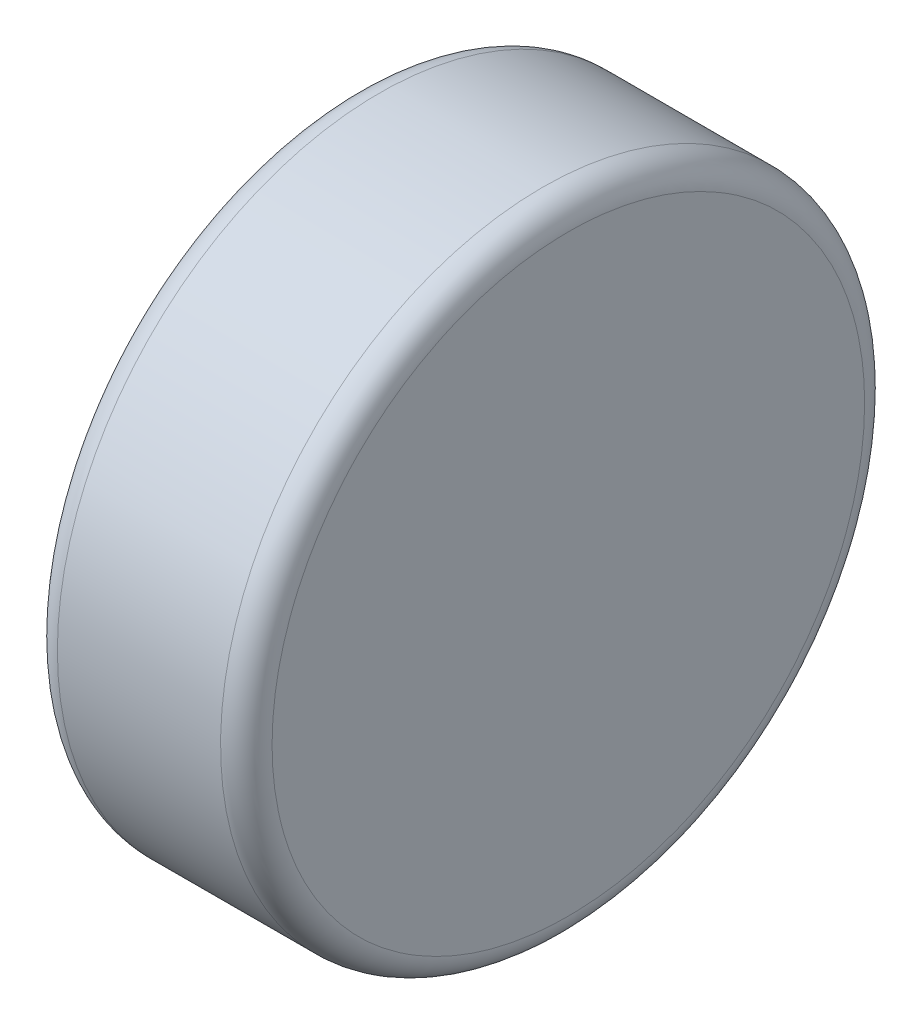
ISO-10303-21;
HEADER;
FILE_DESCRIPTION(('STEP AP214'),'2;1');
FILE_NAME('part.step','',(''),(''),'','','');
FILE_SCHEMA(('AUTOMOTIVE_DESIGN { 1 0 10303 214 1 1 1 1 }'));
ENDSEC;
DATA;
#1=APPLICATION_CONTEXT('core data for automotive mechanical design processes');
#2=APPLICATION_PROTOCOL_DEFINITION('international standard','automotive_design',2000,#1);
#3=PRODUCT_CONTEXT('',#1,'mechanical');
#4=PRODUCT('Part','Part','',(#3));
#5=PRODUCT_RELATED_PRODUCT_CATEGORY('part','',(#4));
#6=PRODUCT_DEFINITION_FORMATION('','',#4);
#7=PRODUCT_DEFINITION_CONTEXT('part definition',#1,'design');
#8=PRODUCT_DEFINITION('design','',#6,#7);
#9=PRODUCT_DEFINITION_SHAPE('','',#8);
#10=(LENGTH_UNIT() NAMED_UNIT(*) SI_UNIT(.MILLI.,.METRE.));
#11=(NAMED_UNIT(*) PLANE_ANGLE_UNIT() SI_UNIT($,.RADIAN.));
#12=(NAMED_UNIT(*) SI_UNIT($,.STERADIAN.) SOLID_ANGLE_UNIT());
#13=UNCERTAINTY_MEASURE_WITH_UNIT(LENGTH_MEASURE(1.E-05),#10,'distance_accuracy_value','');
#14=(GEOMETRIC_REPRESENTATION_CONTEXT(3) GLOBAL_UNCERTAINTY_ASSIGNED_CONTEXT((#13)) GLOBAL_UNIT_ASSIGNED_CONTEXT((#10,
#11,#12)) REPRESENTATION_CONTEXT('',''));
#15=CARTESIAN_POINT('',(0.,0.,0.));
#16=DIRECTION('',(0.,0.,1.));
#17=DIRECTION('',(1.,0.,0.));
#18=AXIS2_PLACEMENT_3D('',#15,#16,#17);
#19=CARTESIAN_POINT('',(3.1,0.,0.75));
#20=DIRECTION('',(1.,0.,0.));
#21=DIRECTION('',(0.,0.,-1.));
#22=AXIS2_PLACEMENT_3D('',#19,#20,#21);
#23=PLANE('',#22);
#24=CARTESIAN_POINT('',(3.1,0.,0.75));
#25=DIRECTION('',(-1.,0.,0.));
#26=DIRECTION('',(0.,0.,1.));
#27=AXIS2_PLACEMENT_3D('',#24,#25,#26);
#28=CIRCLE('',#27,0.69);
#29=CARTESIAN_POINT('',(3.1,0.,1.44));
#30=VERTEX_POINT('',#29);
#31=EDGE_CURVE('E21',#30,#30,#28,.F.);
#32=ORIENTED_EDGE('',*,*,#31,.F.);
#33=EDGE_LOOP('',(#32));
#34=FACE_BOUND('',#33,.T.);
#35=ADVANCED_FACE('F17',(#34),#23,.F.);
#36=CARTESIAN_POINT('',(3.16,0.,0.75));
#37=DIRECTION('',(-1.,0.,0.));
#38=DIRECTION('',(0.,0.,1.));
#39=AXIS2_PLACEMENT_3D('',#36,#37,#38);
#40=TOROIDAL_SURFACE('',#39,0.69,0.0600000000000002);
#41=CARTESIAN_POINT('',(3.16,0.,0.75));
#42=DIRECTION('',(1.,0.,0.));
#43=DIRECTION('',(0.,0.,-1.));
#44=AXIS2_PLACEMENT_3D('',#41,#42,#43);
#45=CIRCLE('',#44,0.75);
#46=CARTESIAN_POINT('',(3.16,0.,0.));
#47=VERTEX_POINT('',#46);
#48=EDGE_CURVE('E58',#47,#47,#45,.T.);
#49=ORIENTED_EDGE('',*,*,#48,.F.);
#50=EDGE_LOOP('',(#49));
#51=FACE_BOUND('',#50,.T.);
#52=ORIENTED_EDGE('',*,*,#31,.T.);
#53=EDGE_LOOP('',(#52));
#54=FACE_BOUND('',#53,.T.);
#55=ADVANCED_FACE('F65',(#51,#54),#40,.T.);
#56=CARTESIAN_POINT('',(3.1,0.,0.75));
#57=DIRECTION('',(1.,0.,0.));
#58=DIRECTION('',(0.,0.,-1.));
#59=AXIS2_PLACEMENT_3D('',#56,#57,#58);
#60=CYLINDRICAL_SURFACE('',#59,0.75);
#61=CARTESIAN_POINT('',(3.54,0.,0.75));
#62=DIRECTION('',(1.,0.,0.));
#63=DIRECTION('',(0.,1.,0.));
#64=AXIS2_PLACEMENT_3D('',#61,#62,#63);
#65=CIRCLE('',#64,0.75);
#66=CARTESIAN_POINT('',(3.54,0.75,0.75));
#67=VERTEX_POINT('',#66);
#68=EDGE_CURVE('E35',#67,#67,#65,.T.);
#69=ORIENTED_EDGE('',*,*,#68,.F.);
#70=EDGE_LOOP('',(#69));
#71=FACE_BOUND('',#70,.T.);
#72=ORIENTED_EDGE('',*,*,#48,.T.);
#73=EDGE_LOOP('',(#72));
#74=FACE_BOUND('',#73,.T.);
#75=ADVANCED_FACE('F44',(#71,#74),#60,.T.);
#76=CARTESIAN_POINT('',(3.54,0.,0.75));
#77=DIRECTION('',(1.,0.,0.));
#78=DIRECTION('',(0.,0.,-1.));
#79=AXIS2_PLACEMENT_3D('',#76,#77,#78);
#80=TOROIDAL_SURFACE('',#79,0.689999999999999,0.0600000000000002);
#81=CARTESIAN_POINT('',(3.6,0.,1.44));
#82=CARTESIAN_POINT('',(3.6,-0.0982222037696499,1.44));
#83=CARTESIAN_POINT('',(3.6,-0.193199999999834,1.41240000000002));
#84=CARTESIAN_POINT('',(3.6,-0.313103465248232,1.37755674428968));
#85=CARTESIAN_POINT('',(3.6,-0.41399999999971,1.30200000000006));
#86=CARTESIAN_POINT('',(3.6,-0.536330666883403,1.2103922263607));
#87=CARTESIAN_POINT('',(3.6,-0.608823529411424,1.07470588235301));
#88=CARTESIAN_POINT('',(3.6,-0.689866267388946,0.923016565073079));
#89=CARTESIAN_POINT('',(3.6,-0.689999999999655,0.75));
#90=CARTESIAN_POINT('',(3.6,-0.690132933898832,0.578016767971372));
#91=CARTESIAN_POINT('',(3.6,-0.608823529411424,0.425294117646992));
#92=CARTESIAN_POINT('',(3.6,-0.537002271387349,0.290392958989918));
#93=CARTESIAN_POINT('',(3.6,-0.41399999999971,0.197999999999938));
#94=CARTESIAN_POINT('',(3.6,-0.314170132921317,0.123012955363329));
#95=CARTESIAN_POINT('',(3.6,-0.193199999999834,0.0875999999999797));
#96=CARTESIAN_POINT('',(3.6,-0.0989188073014708,0.06));
#97=CARTESIAN_POINT('',(3.6,0.,0.06));
#98=B_SPLINE_CURVE_WITH_KNOTS('',2,(#81,#82,#83,#84,#85,#86,#87,#88,#89,#90,#91,#92,#93,#94,#95,
#96,#97),.UNSPECIFIED.,.F.,.F.,(3,2,2,2,2,2,2,2,3),(0.,0.125,0.25,0.375,0.5,0.625,0.75,0.875,
1.),.UNSPECIFIED.);
#99=CARTESIAN_POINT('',(3.6,0.,1.44));
#100=VERTEX_POINT('',#99);
#101=CARTESIAN_POINT('',(3.6,0.,0.0600000000000004));
#102=VERTEX_POINT('',#101);
#103=EDGE_CURVE('E26',#100,#102,#98,.T.);
#104=ORIENTED_EDGE('',*,*,#103,.F.);
#105=CARTESIAN_POINT('',(3.6,0.,0.06));
#106=CARTESIAN_POINT('',(3.6,0.098222203769721,0.06));
#107=CARTESIAN_POINT('',(3.6,0.193199999999834,0.0875999999999797));
#108=CARTESIAN_POINT('',(3.6,0.313103465248331,0.12244325571038));
#109=CARTESIAN_POINT('',(3.6,0.41399999999971,0.197999999999938));
#110=CARTESIAN_POINT('',(3.6,0.536330666883532,0.289607773639416));
#111=CARTESIAN_POINT('',(3.6,0.608823529411424,0.425294117646992));
#112=CARTESIAN_POINT('',(3.6,0.689866267388928,0.576983434927026));
#113=CARTESIAN_POINT('',(3.6,0.689999999999655,0.75));
#114=CARTESIAN_POINT('',(3.6,0.69013293389885,0.921983232028483));
#115=CARTESIAN_POINT('',(3.6,0.608823529411424,1.07470588235301));
#116=CARTESIAN_POINT('',(3.6,0.537002271387414,1.20960704101006));
#117=CARTESIAN_POINT('',(3.6,0.41399999999971,1.30200000000006));
#118=CARTESIAN_POINT('',(3.6,0.314170132921387,1.3769870446366));
#119=CARTESIAN_POINT('',(3.6,0.193199999999834,1.41240000000002));
#120=CARTESIAN_POINT('',(3.6,0.0989188073016164,1.44));
#121=CARTESIAN_POINT('',(3.6,0.,1.44));
#122=B_SPLINE_CURVE_WITH_KNOTS('',2,(#105,#106,#107,#108,#109,#110,#111,#112,#113,#114,#115,
#116,#117,#118,#119,#120,#121),.UNSPECIFIED.,.F.,.F.,(3,2,2,2,2,2,2,2,3),(0.,0.125,0.25,0.375,
0.5,0.625,0.75,0.875,1.),.UNSPECIFIED.);
#123=EDGE_CURVE('E11',#102,#100,#122,.T.);
#124=ORIENTED_EDGE('',*,*,#123,.F.);
#125=EDGE_LOOP('',(#104,#124));
#126=FACE_BOUND('',#125,.T.);
#127=ORIENTED_EDGE('',*,*,#68,.T.);
#128=EDGE_LOOP('',(#127));
#129=FACE_BOUND('',#128,.T.);
#130=ADVANCED_FACE('F19',(#126,#129),#80,.T.);
#131=CARTESIAN_POINT('',(3.6,0.,0.75));
#132=DIRECTION('',(1.,0.,0.));
#133=DIRECTION('',(0.,0.,-1.));
#134=AXIS2_PLACEMENT_3D('',#131,#132,#133);
#135=PLANE('',#134);
#136=ORIENTED_EDGE('',*,*,#103,.T.);
#137=ORIENTED_EDGE('',*,*,#123,.T.);
#138=EDGE_LOOP('',(#136,#137));
#139=FACE_BOUND('',#138,.T.);
#140=ADVANCED_FACE('F37',(#139),#135,.T.);
#141=CLOSED_SHELL('',(#35,#55,#75,#130,#140));
#142=MANIFOLD_SOLID_BREP('B1',#141);
#143=ADVANCED_BREP_SHAPE_REPRESENTATION('',(#18,#142),#14);
#144=SHAPE_DEFINITION_REPRESENTATION(#9,#143);
ENDSEC;
END-ISO-10303-21;
